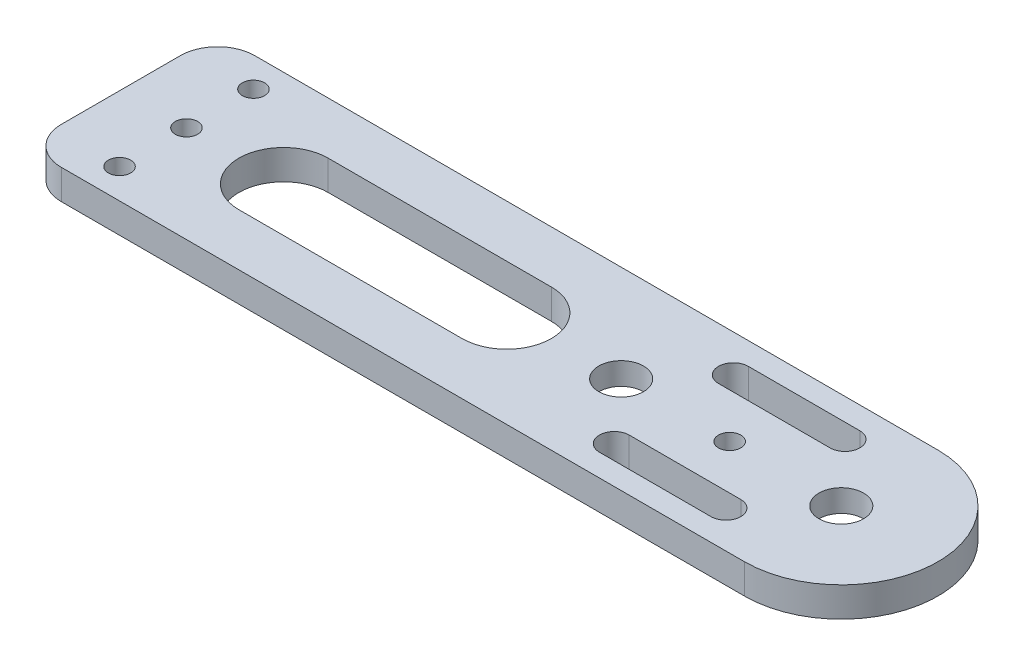
ISO-10303-21;
HEADER;
FILE_DESCRIPTION(('STEP AP214'),'2;1');
FILE_NAME('part.step','',(''),(''),'','','');
FILE_SCHEMA(('AUTOMOTIVE_DESIGN { 1 0 10303 214 1 1 1 1 }'));
ENDSEC;
DATA;
#1=APPLICATION_CONTEXT('core data for automotive mechanical design processes');
#2=APPLICATION_PROTOCOL_DEFINITION('international standard','automotive_design',2000,#1);
#3=PRODUCT_CONTEXT('',#1,'mechanical');
#4=PRODUCT('Part','Part','',(#3));
#5=PRODUCT_RELATED_PRODUCT_CATEGORY('part','',(#4));
#6=PRODUCT_DEFINITION_FORMATION('','',#4);
#7=PRODUCT_DEFINITION_CONTEXT('part definition',#1,'design');
#8=PRODUCT_DEFINITION('design','',#6,#7);
#9=PRODUCT_DEFINITION_SHAPE('','',#8);
#10=(LENGTH_UNIT() NAMED_UNIT(*) SI_UNIT(.MILLI.,.METRE.));
#11=(NAMED_UNIT(*) PLANE_ANGLE_UNIT() SI_UNIT($,.RADIAN.));
#12=(NAMED_UNIT(*) SI_UNIT($,.STERADIAN.) SOLID_ANGLE_UNIT());
#13=UNCERTAINTY_MEASURE_WITH_UNIT(LENGTH_MEASURE(1.E-05),#10,'distance_accuracy_value','');
#14=(GEOMETRIC_REPRESENTATION_CONTEXT(3) GLOBAL_UNCERTAINTY_ASSIGNED_CONTEXT((#13)) GLOBAL_UNIT_ASSIGNED_CONTEXT((#10,
#11,#12)) REPRESENTATION_CONTEXT('',''));
#15=CARTESIAN_POINT('',(0.,0.,0.));
#16=DIRECTION('',(0.,0.,1.));
#17=DIRECTION('',(1.,0.,0.));
#18=AXIS2_PLACEMENT_3D('',#15,#16,#17);
#19=CARTESIAN_POINT('',(150.,4.,0.));
#20=DIRECTION('',(0.,1.,0.));
#21=DIRECTION('',(0.,0.,1.));
#22=AXIS2_PLACEMENT_3D('',#19,#20,#21);
#23=PLANE('',#22);
#24=DIRECTION('',(-1.,0.,0.));
#25=VECTOR('',#24,1.);
#26=CARTESIAN_POINT('',(142.5,4.,6.));
#27=LINE('',#26,#25);
#28=CARTESIAN_POINT('',(142.5,4.,6.));
#29=VERTEX_POINT('',#28);
#30=CARTESIAN_POINT('',(127.5,4.,6.));
#31=VERTEX_POINT('',#30);
#32=EDGE_CURVE('E173',#29,#31,#27,.T.);
#33=ORIENTED_EDGE('',*,*,#32,.F.);
#34=CARTESIAN_POINT('',(142.5,4.,8.));
#35=DIRECTION('',(0.,1.,0.));
#36=DIRECTION('',(0.,0.,-1.));
#37=AXIS2_PLACEMENT_3D('',#34,#35,#36);
#38=CIRCLE('',#37,2.);
#39=CARTESIAN_POINT('',(142.5,4.,10.));
#40=VERTEX_POINT('',#39);
#41=EDGE_CURVE('E163',#40,#29,#38,.T.);
#42=ORIENTED_EDGE('',*,*,#41,.F.);
#43=DIRECTION('',(1.,0.,0.));
#44=VECTOR('',#43,1.);
#45=CARTESIAN_POINT('',(142.5,4.,10.));
#46=LINE('',#45,#44);
#47=CARTESIAN_POINT('',(127.5,4.,10.));
#48=VERTEX_POINT('',#47);
#49=EDGE_CURVE('E189',#48,#40,#46,.T.);
#50=ORIENTED_EDGE('',*,*,#49,.F.);
#51=CARTESIAN_POINT('',(127.5,4.,8.));
#52=DIRECTION('',(0.,1.,0.));
#53=DIRECTION('',(0.,0.,-1.));
#54=AXIS2_PLACEMENT_3D('',#51,#52,#53);
#55=CIRCLE('',#54,2.);
#56=EDGE_CURVE('E187',#31,#48,#55,.T.);
#57=ORIENTED_EDGE('',*,*,#56,.F.);
#58=EDGE_LOOP('',(#33,#42,#50,#57));
#59=FACE_BOUND('',#58,.T.);
#60=DIRECTION('',(-1.,0.,0.));
#61=VECTOR('',#60,1.);
#62=CARTESIAN_POINT('',(142.5,4.,-10.));
#63=LINE('',#62,#61);
#64=CARTESIAN_POINT('',(142.5,4.,-10.));
#65=VERTEX_POINT('',#64);
#66=CARTESIAN_POINT('',(127.5,4.,-10.));
#67=VERTEX_POINT('',#66);
#68=EDGE_CURVE('E209',#65,#67,#63,.T.);
#69=ORIENTED_EDGE('',*,*,#68,.F.);
#70=CARTESIAN_POINT('',(142.5,4.,-8.));
#71=DIRECTION('',(0.,1.,0.));
#72=DIRECTION('',(0.,0.,1.));
#73=AXIS2_PLACEMENT_3D('',#70,#71,#72);
#74=CIRCLE('',#73,2.);
#75=CARTESIAN_POINT('',(142.5,4.,-6.));
#76=VERTEX_POINT('',#75);
#77=EDGE_CURVE('E207',#76,#65,#74,.T.);
#78=ORIENTED_EDGE('',*,*,#77,.F.);
#79=DIRECTION('',(1.,0.,0.));
#80=VECTOR('',#79,1.);
#81=CARTESIAN_POINT('',(142.5,4.,-6.));
#82=LINE('',#81,#80);
#83=CARTESIAN_POINT('',(127.5,4.,-6.));
#84=VERTEX_POINT('',#83);
#85=EDGE_CURVE('E215',#84,#76,#82,.T.);
#86=ORIENTED_EDGE('',*,*,#85,.F.);
#87=CARTESIAN_POINT('',(127.5,4.,-8.));
#88=DIRECTION('',(0.,1.,0.));
#89=DIRECTION('',(0.,0.,1.));
#90=AXIS2_PLACEMENT_3D('',#87,#88,#89);
#91=CIRCLE('',#90,2.);
#92=EDGE_CURVE('E212',#67,#84,#91,.T.);
#93=ORIENTED_EDGE('',*,*,#92,.F.);
#94=EDGE_LOOP('',(#69,#78,#86,#93));
#95=FACE_BOUND('',#94,.T.);
#96=CARTESIAN_POINT('',(62.,4.,9.));
#97=DIRECTION('',(0.,1.,0.));
#98=DIRECTION('',(0.,0.,1.));
#99=AXIS2_PLACEMENT_3D('',#96,#97,#98);
#100=CIRCLE('',#99,1.5);
#101=CARTESIAN_POINT('',(62.,4.,10.5));
#102=VERTEX_POINT('',#101);
#103=EDGE_CURVE('E238',#102,#102,#100,.T.);
#104=ORIENTED_EDGE('',*,*,#103,.F.);
#105=EDGE_LOOP('',(#104));
#106=FACE_BOUND('',#105,.T.);
#107=CARTESIAN_POINT('',(62.,4.,0.));
#108=DIRECTION('',(0.,1.,0.));
#109=DIRECTION('',(0.,0.,1.));
#110=AXIS2_PLACEMENT_3D('',#107,#108,#109);
#111=CIRCLE('',#110,1.5);
#112=CARTESIAN_POINT('',(62.,4.,1.5));
#113=VERTEX_POINT('',#112);
#114=EDGE_CURVE('E250',#113,#113,#111,.T.);
#115=ORIENTED_EDGE('',*,*,#114,.F.);
#116=EDGE_LOOP('',(#115));
#117=FACE_BOUND('',#116,.T.);
#118=DIRECTION('',(-1.,0.,0.));
#119=VECTOR('',#118,1.);
#120=CARTESIAN_POINT('',(105.041482469235,4.,-6.00000000000001));
#121=LINE('',#120,#119);
#122=CARTESIAN_POINT('',(105.041482469235,4.,-6.00000000000001));
#123=VERTEX_POINT('',#122);
#124=CARTESIAN_POINT('',(75.0414824692345,4.,-6.));
#125=VERTEX_POINT('',#124);
#126=EDGE_CURVE('E264',#123,#125,#121,.T.);
#127=ORIENTED_EDGE('',*,*,#126,.F.);
#128=CARTESIAN_POINT('',(105.041482469235,4.,0.));
#129=DIRECTION('',(0.,1.,0.));
#130=DIRECTION('',(0.,0.,1.));
#131=AXIS2_PLACEMENT_3D('',#128,#129,#130);
#132=CIRCLE('',#131,6.);
#133=CARTESIAN_POINT('',(105.041482469235,4.,5.99999999999999));
#134=VERTEX_POINT('',#133);
#135=EDGE_CURVE('E262',#134,#123,#132,.T.);
#136=ORIENTED_EDGE('',*,*,#135,.F.);
#137=DIRECTION('',(1.,0.,0.));
#138=VECTOR('',#137,1.);
#139=CARTESIAN_POINT('',(105.041482469235,4.,5.99999999999999));
#140=LINE('',#139,#138);
#141=CARTESIAN_POINT('',(75.0414824692345,4.,6.));
#142=VERTEX_POINT('',#141);
#143=EDGE_CURVE('E270',#142,#134,#140,.T.);
#144=ORIENTED_EDGE('',*,*,#143,.F.);
#145=CARTESIAN_POINT('',(75.0414824692345,4.,0.));
#146=DIRECTION('',(0.,1.,0.));
#147=DIRECTION('',(0.,0.,1.));
#148=AXIS2_PLACEMENT_3D('',#145,#146,#147);
#149=CIRCLE('',#148,6.);
#150=EDGE_CURVE('E267',#125,#142,#149,.T.);
#151=ORIENTED_EDGE('',*,*,#150,.F.);
#152=EDGE_LOOP('',(#127,#136,#144,#151));
#153=FACE_BOUND('',#152,.T.);
#154=CARTESIAN_POINT('',(120.4195,4.,0.));
#155=DIRECTION('',(0.,1.,0.));
#156=DIRECTION('',(0.,0.,1.));
#157=AXIS2_PLACEMENT_3D('',#154,#155,#156);
#158=CIRCLE('',#157,3.00000000000001);
#159=CARTESIAN_POINT('',(120.4195,4.,3.00000000000001));
#160=VERTEX_POINT('',#159);
#161=EDGE_CURVE('E292',#160,#160,#158,.T.);
#162=ORIENTED_EDGE('',*,*,#161,.F.);
#163=EDGE_LOOP('',(#162));
#164=FACE_BOUND('',#163,.T.);
#165=CARTESIAN_POINT('',(150.,4.,0.));
#166=DIRECTION('',(0.,1.,0.));
#167=DIRECTION('',(0.,0.,1.));
#168=AXIS2_PLACEMENT_3D('',#165,#166,#167);
#169=CIRCLE('',#168,2.99999999999999);
#170=CARTESIAN_POINT('',(150.,4.,2.99999999999999));
#171=VERTEX_POINT('',#170);
#172=EDGE_CURVE('E295',#171,#171,#169,.T.);
#173=ORIENTED_EDGE('',*,*,#172,.F.);
#174=EDGE_LOOP('',(#173));
#175=FACE_BOUND('',#174,.T.);
#176=CARTESIAN_POINT('',(135.,4.,0.));
#177=DIRECTION('',(0.,1.,0.));
#178=DIRECTION('',(0.,0.,1.));
#179=AXIS2_PLACEMENT_3D('',#176,#177,#178);
#180=CIRCLE('',#179,1.5);
#181=CARTESIAN_POINT('',(135.,4.,1.5));
#182=VERTEX_POINT('',#181);
#183=EDGE_CURVE('E256',#182,#182,#180,.T.);
#184=ORIENTED_EDGE('',*,*,#183,.F.);
#185=EDGE_LOOP('',(#184));
#186=FACE_BOUND('',#185,.T.);
#187=CARTESIAN_POINT('',(62.,4.,-9.));
#188=DIRECTION('',(0.,1.,0.));
#189=DIRECTION('',(0.,0.,1.));
#190=AXIS2_PLACEMENT_3D('',#187,#188,#189);
#191=CIRCLE('',#190,1.5);
#192=CARTESIAN_POINT('',(62.,4.,-7.5));
#193=VERTEX_POINT('',#192);
#194=EDGE_CURVE('E244',#193,#193,#191,.T.);
#195=ORIENTED_EDGE('',*,*,#194,.F.);
#196=EDGE_LOOP('',(#195));
#197=FACE_BOUND('',#196,.T.);
#198=DIRECTION('',(-1.,0.,0.));
#199=VECTOR('',#198,1.);
#200=CARTESIAN_POINT('',(150.,4.,-13.));
#201=LINE('',#200,#199);
#202=CARTESIAN_POINT('',(150.,4.,-13.));
#203=VERTEX_POINT('',#202);
#204=CARTESIAN_POINT('',(58.1782411874855,4.,-13.));
#205=VERTEX_POINT('',#204);
#206=EDGE_CURVE('E302',#203,#205,#201,.T.);
#207=ORIENTED_EDGE('',*,*,#206,.T.);
#208=CARTESIAN_POINT('',(58.1782411874856,4.,-7.99999999999999));
#209=DIRECTION('',(0.,1.,0.));
#210=DIRECTION('',(0.,0.,1.));
#211=AXIS2_PLACEMENT_3D('',#208,#209,#210);
#212=CIRCLE('',#211,5.);
#213=CARTESIAN_POINT('',(53.1782411874856,4.,-7.99999999999999));
#214=VERTEX_POINT('',#213);
#215=EDGE_CURVE('E45',#205,#214,#212,.T.);
#216=ORIENTED_EDGE('',*,*,#215,.T.);
#217=DIRECTION('',(0.,0.,1.));
#218=VECTOR('',#217,1.);
#219=CARTESIAN_POINT('',(53.1782411874856,4.,-23.043979085771));
#220=LINE('',#219,#218);
#221=CARTESIAN_POINT('',(53.1782411874856,4.,8.00000000000001));
#222=VERTEX_POINT('',#221);
#223=EDGE_CURVE('E337',#214,#222,#220,.T.);
#224=ORIENTED_EDGE('',*,*,#223,.T.);
#225=CARTESIAN_POINT('',(58.1782411874856,4.,8.00000000000001));
#226=DIRECTION('',(0.,1.,0.));
#227=DIRECTION('',(0.,0.,1.));
#228=AXIS2_PLACEMENT_3D('',#225,#226,#227);
#229=CIRCLE('',#228,5.);
#230=CARTESIAN_POINT('',(58.1782411874855,4.,13.));
#231=VERTEX_POINT('',#230);
#232=EDGE_CURVE('E52',#222,#231,#229,.T.);
#233=ORIENTED_EDGE('',*,*,#232,.T.);
#234=DIRECTION('',(1.,0.,0.));
#235=VECTOR('',#234,1.);
#236=CARTESIAN_POINT('',(150.,4.,13.));
#237=LINE('',#236,#235);
#238=CARTESIAN_POINT('',(150.,4.,13.));
#239=VERTEX_POINT('',#238);
#240=EDGE_CURVE('E305',#231,#239,#237,.T.);
#241=ORIENTED_EDGE('',*,*,#240,.T.);
#242=CARTESIAN_POINT('',(150.,4.,0.));
#243=DIRECTION('',(0.,1.,0.));
#244=DIRECTION('',(0.,0.,1.));
#245=AXIS2_PLACEMENT_3D('',#242,#243,#244);
#246=CIRCLE('',#245,13.);
#247=EDGE_CURVE('E299',#239,#203,#246,.T.);
#248=ORIENTED_EDGE('',*,*,#247,.T.);
#249=EDGE_LOOP('',(#207,#216,#224,#233,#241,#248));
#250=FACE_BOUND('',#249,.T.);
#251=ADVANCED_FACE('F37',(#59,#95,#106,#117,#153,#164,#175,#186,#197,#250),#23,.T.);
#252=CARTESIAN_POINT('',(150.,0.,0.));
#253=DIRECTION('',(0.,1.,0.));
#254=DIRECTION('',(0.,0.,1.));
#255=AXIS2_PLACEMENT_3D('',#252,#253,#254);
#256=PLANE('',#255);
#257=CARTESIAN_POINT('',(142.5,0.,8.));
#258=DIRECTION('',(0.,1.,0.));
#259=DIRECTION('',(0.,0.,-1.));
#260=AXIS2_PLACEMENT_3D('',#257,#258,#259);
#261=CIRCLE('',#260,2.);
#262=CARTESIAN_POINT('',(142.5,0.,10.));
#263=VERTEX_POINT('',#262);
#264=CARTESIAN_POINT('',(142.5,0.,6.));
#265=VERTEX_POINT('',#264);
#266=EDGE_CURVE('E194',#263,#265,#261,.T.);
#267=ORIENTED_EDGE('',*,*,#266,.T.);
#268=DIRECTION('',(-1.,0.,0.));
#269=VECTOR('',#268,1.);
#270=CARTESIAN_POINT('',(142.5,0.,6.));
#271=LINE('',#270,#269);
#272=CARTESIAN_POINT('',(127.5,0.,6.));
#273=VERTEX_POINT('',#272);
#274=EDGE_CURVE('E180',#265,#273,#271,.T.);
#275=ORIENTED_EDGE('',*,*,#274,.T.);
#276=CARTESIAN_POINT('',(127.5,0.,8.));
#277=DIRECTION('',(0.,1.,0.));
#278=DIRECTION('',(0.,0.,-1.));
#279=AXIS2_PLACEMENT_3D('',#276,#277,#278);
#280=CIRCLE('',#279,2.);
#281=CARTESIAN_POINT('',(127.5,0.,10.));
#282=VERTEX_POINT('',#281);
#283=EDGE_CURVE('E198',#273,#282,#280,.T.);
#284=ORIENTED_EDGE('',*,*,#283,.T.);
#285=DIRECTION('',(1.,0.,0.));
#286=VECTOR('',#285,1.);
#287=CARTESIAN_POINT('',(142.5,0.,10.));
#288=LINE('',#287,#286);
#289=EDGE_CURVE('E174',#282,#263,#288,.T.);
#290=ORIENTED_EDGE('',*,*,#289,.T.);
#291=EDGE_LOOP('',(#267,#275,#284,#290));
#292=FACE_BOUND('',#291,.T.);
#293=CARTESIAN_POINT('',(62.,0.,9.));
#294=DIRECTION('',(0.,1.,0.));
#295=DIRECTION('',(0.,0.,1.));
#296=AXIS2_PLACEMENT_3D('',#293,#294,#295);
#297=CIRCLE('',#296,1.5);
#298=CARTESIAN_POINT('',(62.,0.,10.5));
#299=VERTEX_POINT('',#298);
#300=EDGE_CURVE('E237',#299,#299,#297,.T.);
#301=ORIENTED_EDGE('',*,*,#300,.T.);
#302=EDGE_LOOP('',(#301));
#303=FACE_BOUND('',#302,.T.);
#304=CARTESIAN_POINT('',(62.,0.,-9.));
#305=DIRECTION('',(0.,1.,0.));
#306=DIRECTION('',(0.,0.,1.));
#307=AXIS2_PLACEMENT_3D('',#304,#305,#306);
#308=CIRCLE('',#307,1.5);
#309=CARTESIAN_POINT('',(62.,0.,-7.5));
#310=VERTEX_POINT('',#309);
#311=EDGE_CURVE('E241',#310,#310,#308,.T.);
#312=ORIENTED_EDGE('',*,*,#311,.T.);
#313=EDGE_LOOP('',(#312));
#314=FACE_BOUND('',#313,.T.);
#315=CARTESIAN_POINT('',(62.,0.,0.));
#316=DIRECTION('',(0.,1.,0.));
#317=DIRECTION('',(0.,0.,1.));
#318=AXIS2_PLACEMENT_3D('',#315,#316,#317);
#319=CIRCLE('',#318,1.5);
#320=CARTESIAN_POINT('',(62.,0.,1.5));
#321=VERTEX_POINT('',#320);
#322=EDGE_CURVE('E247',#321,#321,#319,.T.);
#323=ORIENTED_EDGE('',*,*,#322,.T.);
#324=EDGE_LOOP('',(#323));
#325=FACE_BOUND('',#324,.T.);
#326=CARTESIAN_POINT('',(135.,0.,0.));
#327=DIRECTION('',(0.,1.,0.));
#328=DIRECTION('',(0.,0.,1.));
#329=AXIS2_PLACEMENT_3D('',#326,#327,#328);
#330=CIRCLE('',#329,1.5);
#331=CARTESIAN_POINT('',(135.,0.,1.5));
#332=VERTEX_POINT('',#331);
#333=EDGE_CURVE('E253',#332,#332,#330,.T.);
#334=ORIENTED_EDGE('',*,*,#333,.T.);
#335=EDGE_LOOP('',(#334));
#336=FACE_BOUND('',#335,.T.);
#337=CARTESIAN_POINT('',(105.041482469235,0.,0.));
#338=DIRECTION('',(0.,1.,0.));
#339=DIRECTION('',(0.,0.,1.));
#340=AXIS2_PLACEMENT_3D('',#337,#338,#339);
#341=CIRCLE('',#340,6.);
#342=CARTESIAN_POINT('',(105.041482469235,0.,5.99999999999999));
#343=VERTEX_POINT('',#342);
#344=CARTESIAN_POINT('',(105.041482469235,0.,-6.00000000000001));
#345=VERTEX_POINT('',#344);
#346=EDGE_CURVE('E259',#343,#345,#341,.T.);
#347=ORIENTED_EDGE('',*,*,#346,.T.);
#348=DIRECTION('',(-1.,0.,0.));
#349=VECTOR('',#348,1.);
#350=CARTESIAN_POINT('',(105.041482469235,0.,-6.00000000000001));
#351=LINE('',#350,#349);
#352=CARTESIAN_POINT('',(75.0414824692345,0.,-6.));
#353=VERTEX_POINT('',#352);
#354=EDGE_CURVE('E275',#345,#353,#351,.T.);
#355=ORIENTED_EDGE('',*,*,#354,.T.);
#356=CARTESIAN_POINT('',(75.0414824692345,0.,0.));
#357=DIRECTION('',(0.,1.,0.));
#358=DIRECTION('',(0.,0.,1.));
#359=AXIS2_PLACEMENT_3D('',#356,#357,#358);
#360=CIRCLE('',#359,6.);
#361=CARTESIAN_POINT('',(75.0414824692345,0.,6.));
#362=VERTEX_POINT('',#361);
#363=EDGE_CURVE('E278',#353,#362,#360,.T.);
#364=ORIENTED_EDGE('',*,*,#363,.T.);
#365=DIRECTION('',(1.,0.,0.));
#366=VECTOR('',#365,1.);
#367=CARTESIAN_POINT('',(105.041482469235,0.,5.99999999999999));
#368=LINE('',#367,#366);
#369=EDGE_CURVE('E265',#362,#343,#368,.T.);
#370=ORIENTED_EDGE('',*,*,#369,.T.);
#371=EDGE_LOOP('',(#347,#355,#364,#370));
#372=FACE_BOUND('',#371,.T.);
#373=CARTESIAN_POINT('',(142.5,0.,-8.));
#374=DIRECTION('',(0.,1.,0.));
#375=DIRECTION('',(0.,0.,1.));
#376=AXIS2_PLACEMENT_3D('',#373,#374,#375);
#377=CIRCLE('',#376,2.);
#378=CARTESIAN_POINT('',(142.5,0.,-6.));
#379=VERTEX_POINT('',#378);
#380=CARTESIAN_POINT('',(142.5,0.,-10.));
#381=VERTEX_POINT('',#380);
#382=EDGE_CURVE('E181',#379,#381,#377,.T.);
#383=ORIENTED_EDGE('',*,*,#382,.T.);
#384=DIRECTION('',(-1.,0.,0.));
#385=VECTOR('',#384,1.);
#386=CARTESIAN_POINT('',(142.5,0.,-10.));
#387=LINE('',#386,#385);
#388=CARTESIAN_POINT('',(127.5,0.,-10.));
#389=VERTEX_POINT('',#388);
#390=EDGE_CURVE('E220',#381,#389,#387,.T.);
#391=ORIENTED_EDGE('',*,*,#390,.T.);
#392=CARTESIAN_POINT('',(127.5,0.,-8.));
#393=DIRECTION('',(0.,1.,0.));
#394=DIRECTION('',(0.,0.,1.));
#395=AXIS2_PLACEMENT_3D('',#392,#393,#394);
#396=CIRCLE('',#395,2.);
#397=CARTESIAN_POINT('',(127.5,0.,-6.));
#398=VERTEX_POINT('',#397);
#399=EDGE_CURVE('E223',#389,#398,#396,.T.);
#400=ORIENTED_EDGE('',*,*,#399,.T.);
#401=DIRECTION('',(1.,0.,0.));
#402=VECTOR('',#401,1.);
#403=CARTESIAN_POINT('',(142.5,0.,-6.));
#404=LINE('',#403,#402);
#405=EDGE_CURVE('E210',#398,#379,#404,.T.);
#406=ORIENTED_EDGE('',*,*,#405,.T.);
#407=EDGE_LOOP('',(#383,#391,#400,#406));
#408=FACE_BOUND('',#407,.T.);
#409=CARTESIAN_POINT('',(120.4195,0.,0.));
#410=DIRECTION('',(0.,-1.,0.));
#411=DIRECTION('',(0.,0.,-1.));
#412=AXIS2_PLACEMENT_3D('',#409,#410,#411);
#413=CIRCLE('',#412,6.01000000000001);
#414=CARTESIAN_POINT('',(120.4195,0.,-6.01000000000001));
#415=VERTEX_POINT('',#414);
#416=EDGE_CURVE('E654',#415,#415,#413,.T.);
#417=ORIENTED_EDGE('',*,*,#416,.F.);
#418=EDGE_LOOP('',(#417));
#419=FACE_BOUND('',#418,.T.);
#420=CARTESIAN_POINT('',(150.,0.,0.));
#421=DIRECTION('',(0.,-1.,0.));
#422=DIRECTION('',(0.,0.,-1.));
#423=AXIS2_PLACEMENT_3D('',#420,#421,#422);
#424=CIRCLE('',#423,6.01);
#425=CARTESIAN_POINT('',(150.,0.,-6.01));
#426=VERTEX_POINT('',#425);
#427=EDGE_CURVE('E646',#426,#426,#424,.T.);
#428=ORIENTED_EDGE('',*,*,#427,.F.);
#429=EDGE_LOOP('',(#428));
#430=FACE_BOUND('',#429,.T.);
#431=DIRECTION('',(0.,0.,1.));
#432=VECTOR('',#431,1.);
#433=CARTESIAN_POINT('',(53.1782411874856,0.,0.));
#434=LINE('',#433,#432);
#435=CARTESIAN_POINT('',(53.1782411874856,0.,-7.99999999999999));
#436=VERTEX_POINT('',#435);
#437=CARTESIAN_POINT('',(53.1782411874856,0.,8.00000000000001));
#438=VERTEX_POINT('',#437);
#439=EDGE_CURVE('E345',#436,#438,#434,.T.);
#440=ORIENTED_EDGE('',*,*,#439,.F.);
#441=CARTESIAN_POINT('',(58.1782411874856,0.,-7.99999999999999));
#442=DIRECTION('',(0.,1.,0.));
#443=DIRECTION('',(0.,0.,1.));
#444=AXIS2_PLACEMENT_3D('',#441,#442,#443);
#445=CIRCLE('',#444,5.);
#446=CARTESIAN_POINT('',(58.1782411874855,0.,-13.));
#447=VERTEX_POINT('',#446);
#448=EDGE_CURVE('E332',#436,#447,#445,.F.);
#449=ORIENTED_EDGE('',*,*,#448,.T.);
#450=DIRECTION('',(-1.,0.,0.));
#451=VECTOR('',#450,1.);
#452=CARTESIAN_POINT('',(150.,0.,-13.));
#453=LINE('',#452,#451);
#454=CARTESIAN_POINT('',(150.,0.,-13.));
#455=VERTEX_POINT('',#454);
#456=EDGE_CURVE('E310',#455,#447,#453,.T.);
#457=ORIENTED_EDGE('',*,*,#456,.F.);
#458=CARTESIAN_POINT('',(150.,0.,0.));
#459=DIRECTION('',(0.,1.,0.));
#460=DIRECTION('',(0.,0.,1.));
#461=AXIS2_PLACEMENT_3D('',#458,#459,#460);
#462=CIRCLE('',#461,13.);
#463=CARTESIAN_POINT('',(150.,0.,13.));
#464=VERTEX_POINT('',#463);
#465=EDGE_CURVE('E298',#464,#455,#462,.T.);
#466=ORIENTED_EDGE('',*,*,#465,.F.);
#467=DIRECTION('',(1.,0.,0.));
#468=VECTOR('',#467,1.);
#469=CARTESIAN_POINT('',(150.,0.,13.));
#470=LINE('',#469,#468);
#471=CARTESIAN_POINT('',(58.1782411874855,0.,13.));
#472=VERTEX_POINT('',#471);
#473=EDGE_CURVE('E303',#472,#464,#470,.T.);
#474=ORIENTED_EDGE('',*,*,#473,.F.);
#475=CARTESIAN_POINT('',(58.1782411874856,0.,8.00000000000001));
#476=DIRECTION('',(0.,1.,0.));
#477=DIRECTION('',(0.,0.,1.));
#478=AXIS2_PLACEMENT_3D('',#475,#476,#477);
#479=CIRCLE('',#478,5.);
#480=EDGE_CURVE('E330',#472,#438,#479,.F.);
#481=ORIENTED_EDGE('',*,*,#480,.T.);
#482=EDGE_LOOP('',(#440,#449,#457,#466,#474,#481));
#483=FACE_BOUND('',#482,.T.);
#484=ADVANCED_FACE('F349',(#292,#303,#314,#325,#336,#372,#408,#419,#430,#483),#256,.F.);
#485=CARTESIAN_POINT('',(150.,4.,-13.));
#486=DIRECTION('',(0.,0.,1.));
#487=DIRECTION('',(1.,0.,0.));
#488=AXIS2_PLACEMENT_3D('',#485,#486,#487);
#489=PLANE('',#488);
#490=ORIENTED_EDGE('',*,*,#456,.T.);
#491=DIRECTION('',(0.,-1.,0.));
#492=VECTOR('',#491,1.);
#493=CARTESIAN_POINT('',(58.1782411874856,4.,-13.));
#494=LINE('',#493,#492);
#495=EDGE_CURVE('E60',#447,#205,#494,.F.);
#496=ORIENTED_EDGE('',*,*,#495,.T.);
#497=ORIENTED_EDGE('',*,*,#206,.F.);
#498=DIRECTION('',(0.,-1.,0.));
#499=VECTOR('',#498,1.);
#500=CARTESIAN_POINT('',(150.,4.,-13.));
#501=LINE('',#500,#499);
#502=EDGE_CURVE('E315',#203,#455,#501,.T.);
#503=ORIENTED_EDGE('',*,*,#502,.T.);
#504=EDGE_LOOP('',(#490,#496,#497,#503));
#505=FACE_BOUND('',#504,.T.);
#506=ADVANCED_FACE('F351',(#505),#489,.F.);
#507=CARTESIAN_POINT('',(150.,4.,13.));
#508=DIRECTION('',(0.,0.,-1.));
#509=DIRECTION('',(-1.,0.,0.));
#510=AXIS2_PLACEMENT_3D('',#507,#508,#509);
#511=PLANE('',#510);
#512=ORIENTED_EDGE('',*,*,#240,.F.);
#513=DIRECTION('',(0.,1.,0.));
#514=VECTOR('',#513,1.);
#515=CARTESIAN_POINT('',(58.1782411874856,0.,13.));
#516=LINE('',#515,#514);
#517=EDGE_CURVE('E11',#231,#472,#516,.F.);
#518=ORIENTED_EDGE('',*,*,#517,.T.);
#519=ORIENTED_EDGE('',*,*,#473,.T.);
#520=DIRECTION('',(0.,-1.,0.));
#521=VECTOR('',#520,1.);
#522=CARTESIAN_POINT('',(150.,4.,13.));
#523=LINE('',#522,#521);
#524=EDGE_CURVE('E307',#239,#464,#523,.T.);
#525=ORIENTED_EDGE('',*,*,#524,.F.);
#526=EDGE_LOOP('',(#512,#518,#519,#525));
#527=FACE_BOUND('',#526,.T.);
#528=ADVANCED_FACE('F362',(#527),#511,.F.);
#529=CARTESIAN_POINT('',(150.,4.,0.));
#530=DIRECTION('',(0.,-1.,0.));
#531=DIRECTION('',(0.,0.,-1.));
#532=AXIS2_PLACEMENT_3D('',#529,#530,#531);
#533=CYLINDRICAL_SURFACE('',#532,2.99999999999999);
#534=ORIENTED_EDGE('',*,*,#172,.T.);
#535=EDGE_LOOP('',(#534));
#536=FACE_BOUND('',#535,.T.);
#537=CARTESIAN_POINT('',(150.,1.,0.));
#538=DIRECTION('',(0.,-1.,0.));
#539=DIRECTION('',(0.,0.,-1.));
#540=AXIS2_PLACEMENT_3D('',#537,#538,#539);
#541=CIRCLE('',#540,2.99999999999999);
#542=CARTESIAN_POINT('',(150.,1.,-2.99999999999999));
#543=VERTEX_POINT('',#542);
#544=EDGE_CURVE('E196',#543,#543,#541,.T.);
#545=ORIENTED_EDGE('',*,*,#544,.T.);
#546=EDGE_LOOP('',(#545));
#547=FACE_BOUND('',#546,.T.);
#548=ADVANCED_FACE('F364',(#536,#547),#533,.F.);
#549=CARTESIAN_POINT('',(120.4195,4.,0.));
#550=DIRECTION('',(0.,-1.,0.));
#551=DIRECTION('',(0.,0.,-1.));
#552=AXIS2_PLACEMENT_3D('',#549,#550,#551);
#553=CYLINDRICAL_SURFACE('',#552,3.00000000000001);
#554=ORIENTED_EDGE('',*,*,#161,.T.);
#555=EDGE_LOOP('',(#554));
#556=FACE_BOUND('',#555,.T.);
#557=CARTESIAN_POINT('',(120.4195,1.,0.));
#558=DIRECTION('',(0.,-1.,0.));
#559=DIRECTION('',(0.,0.,-1.));
#560=AXIS2_PLACEMENT_3D('',#557,#558,#559);
#561=CIRCLE('',#560,3.00000000000001);
#562=CARTESIAN_POINT('',(120.4195,1.,-3.00000000000001));
#563=VERTEX_POINT('',#562);
#564=EDGE_CURVE('E319',#563,#563,#561,.T.);
#565=ORIENTED_EDGE('',*,*,#564,.T.);
#566=EDGE_LOOP('',(#565));
#567=FACE_BOUND('',#566,.T.);
#568=ADVANCED_FACE('F370',(#556,#567),#553,.F.);
#569=CARTESIAN_POINT('',(150.,4.,0.));
#570=DIRECTION('',(0.,-1.,0.));
#571=DIRECTION('',(0.,0.,-1.));
#572=AXIS2_PLACEMENT_3D('',#569,#570,#571);
#573=CYLINDRICAL_SURFACE('',#572,13.);
#574=ORIENTED_EDGE('',*,*,#465,.T.);
#575=ORIENTED_EDGE('',*,*,#502,.F.);
#576=ORIENTED_EDGE('',*,*,#247,.F.);
#577=ORIENTED_EDGE('',*,*,#524,.T.);
#578=EDGE_LOOP('',(#574,#575,#576,#577));
#579=FACE_BOUND('',#578,.T.);
#580=ADVANCED_FACE('F355',(#579),#573,.T.);
#581=CARTESIAN_POINT('',(105.041482469235,4.,0.));
#582=DIRECTION('',(0.,-1.,0.));
#583=DIRECTION('',(0.,0.,-1.));
#584=AXIS2_PLACEMENT_3D('',#581,#582,#583);
#585=CYLINDRICAL_SURFACE('',#584,6.);
#586=ORIENTED_EDGE('',*,*,#346,.F.);
#587=DIRECTION('',(0.,-1.,0.));
#588=VECTOR('',#587,1.);
#589=CARTESIAN_POINT('',(105.041482469235,4.,5.99999999999999));
#590=LINE('',#589,#588);
#591=EDGE_CURVE('E272',#134,#343,#590,.T.);
#592=ORIENTED_EDGE('',*,*,#591,.F.);
#593=ORIENTED_EDGE('',*,*,#135,.T.);
#594=DIRECTION('',(0.,-1.,0.));
#595=VECTOR('',#594,1.);
#596=CARTESIAN_POINT('',(105.041482469235,4.,-6.00000000000001));
#597=LINE('',#596,#595);
#598=EDGE_CURVE('E289',#123,#345,#597,.T.);
#599=ORIENTED_EDGE('',*,*,#598,.T.);
#600=EDGE_LOOP('',(#586,#592,#593,#599));
#601=FACE_BOUND('',#600,.T.);
#602=ADVANCED_FACE('F385',(#601),#585,.F.);
#603=CARTESIAN_POINT('',(105.041482469235,4.,-6.00000000000001));
#604=DIRECTION('',(0.,0.,1.));
#605=DIRECTION('',(1.,0.,0.));
#606=AXIS2_PLACEMENT_3D('',#603,#604,#605);
#607=PLANE('',#606);
#608=ORIENTED_EDGE('',*,*,#354,.F.);
#609=ORIENTED_EDGE('',*,*,#598,.F.);
#610=ORIENTED_EDGE('',*,*,#126,.T.);
#611=DIRECTION('',(0.,-1.,0.));
#612=VECTOR('',#611,1.);
#613=CARTESIAN_POINT('',(75.0414824692345,4.,-6.));
#614=LINE('',#613,#612);
#615=EDGE_CURVE('E287',#125,#353,#614,.T.);
#616=ORIENTED_EDGE('',*,*,#615,.T.);
#617=EDGE_LOOP('',(#608,#609,#610,#616));
#618=FACE_BOUND('',#617,.T.);
#619=ADVANCED_FACE('F388',(#618),#607,.T.);
#620=CARTESIAN_POINT('',(75.0414824692345,4.,0.));
#621=DIRECTION('',(0.,-1.,0.));
#622=DIRECTION('',(0.,0.,-1.));
#623=AXIS2_PLACEMENT_3D('',#620,#621,#622);
#624=CYLINDRICAL_SURFACE('',#623,6.);
#625=ORIENTED_EDGE('',*,*,#363,.F.);
#626=ORIENTED_EDGE('',*,*,#615,.F.);
#627=ORIENTED_EDGE('',*,*,#150,.T.);
#628=DIRECTION('',(0.,-1.,0.));
#629=VECTOR('',#628,1.);
#630=CARTESIAN_POINT('',(75.0414824692345,4.,6.));
#631=LINE('',#630,#629);
#632=EDGE_CURVE('E285',#142,#362,#631,.T.);
#633=ORIENTED_EDGE('',*,*,#632,.T.);
#634=EDGE_LOOP('',(#625,#626,#627,#633));
#635=FACE_BOUND('',#634,.T.);
#636=ADVANCED_FACE('F392',(#635),#624,.F.);
#637=CARTESIAN_POINT('',(105.041482469235,4.,5.99999999999999));
#638=DIRECTION('',(0.,0.,-1.));
#639=DIRECTION('',(-1.,0.,0.));
#640=AXIS2_PLACEMENT_3D('',#637,#638,#639);
#641=PLANE('',#640);
#642=ORIENTED_EDGE('',*,*,#369,.F.);
#643=ORIENTED_EDGE('',*,*,#632,.F.);
#644=ORIENTED_EDGE('',*,*,#143,.T.);
#645=ORIENTED_EDGE('',*,*,#591,.T.);
#646=EDGE_LOOP('',(#642,#643,#644,#645));
#647=FACE_BOUND('',#646,.T.);
#648=ADVANCED_FACE('F396',(#647),#641,.T.);
#649=CARTESIAN_POINT('',(135.,4.,0.));
#650=DIRECTION('',(0.,-1.,0.));
#651=DIRECTION('',(0.,0.,-1.));
#652=AXIS2_PLACEMENT_3D('',#649,#650,#651);
#653=CYLINDRICAL_SURFACE('',#652,1.5);
#654=ORIENTED_EDGE('',*,*,#183,.T.);
#655=EDGE_LOOP('',(#654));
#656=FACE_BOUND('',#655,.T.);
#657=ORIENTED_EDGE('',*,*,#333,.F.);
#658=EDGE_LOOP('',(#657));
#659=FACE_BOUND('',#658,.T.);
#660=ADVANCED_FACE('F400',(#656,#659),#653,.F.);
#661=CARTESIAN_POINT('',(62.,4.,0.));
#662=DIRECTION('',(0.,-1.,0.));
#663=DIRECTION('',(0.,0.,-1.));
#664=AXIS2_PLACEMENT_3D('',#661,#662,#663);
#665=CYLINDRICAL_SURFACE('',#664,1.5);
#666=ORIENTED_EDGE('',*,*,#114,.T.);
#667=EDGE_LOOP('',(#666));
#668=FACE_BOUND('',#667,.T.);
#669=ORIENTED_EDGE('',*,*,#322,.F.);
#670=EDGE_LOOP('',(#669));
#671=FACE_BOUND('',#670,.T.);
#672=ADVANCED_FACE('F404',(#668,#671),#665,.F.);
#673=CARTESIAN_POINT('',(62.,4.,-9.));
#674=DIRECTION('',(0.,-1.,0.));
#675=DIRECTION('',(0.,0.,-1.));
#676=AXIS2_PLACEMENT_3D('',#673,#674,#675);
#677=CYLINDRICAL_SURFACE('',#676,1.5);
#678=ORIENTED_EDGE('',*,*,#194,.T.);
#679=EDGE_LOOP('',(#678));
#680=FACE_BOUND('',#679,.T.);
#681=ORIENTED_EDGE('',*,*,#311,.F.);
#682=EDGE_LOOP('',(#681));
#683=FACE_BOUND('',#682,.T.);
#684=ADVANCED_FACE('F408',(#680,#683),#677,.F.);
#685=CARTESIAN_POINT('',(62.,4.,9.));
#686=DIRECTION('',(0.,-1.,0.));
#687=DIRECTION('',(0.,0.,-1.));
#688=AXIS2_PLACEMENT_3D('',#685,#686,#687);
#689=CYLINDRICAL_SURFACE('',#688,1.5);
#690=ORIENTED_EDGE('',*,*,#103,.T.);
#691=EDGE_LOOP('',(#690));
#692=FACE_BOUND('',#691,.T.);
#693=ORIENTED_EDGE('',*,*,#300,.F.);
#694=EDGE_LOOP('',(#693));
#695=FACE_BOUND('',#694,.T.);
#696=ADVANCED_FACE('F412',(#692,#695),#689,.F.);
#697=CARTESIAN_POINT('',(142.5,4.,-8.));
#698=DIRECTION('',(0.,-1.,0.));
#699=DIRECTION('',(0.,0.,-1.));
#700=AXIS2_PLACEMENT_3D('',#697,#698,#699);
#701=CYLINDRICAL_SURFACE('',#700,2.);
#702=ORIENTED_EDGE('',*,*,#382,.F.);
#703=DIRECTION('',(0.,-1.,0.));
#704=VECTOR('',#703,1.);
#705=CARTESIAN_POINT('',(142.5,4.,-6.));
#706=LINE('',#705,#704);
#707=EDGE_CURVE('E217',#76,#379,#706,.T.);
#708=ORIENTED_EDGE('',*,*,#707,.F.);
#709=ORIENTED_EDGE('',*,*,#77,.T.);
#710=DIRECTION('',(0.,-1.,0.));
#711=VECTOR('',#710,1.);
#712=CARTESIAN_POINT('',(142.5,4.,-10.));
#713=LINE('',#712,#711);
#714=EDGE_CURVE('E234',#65,#381,#713,.T.);
#715=ORIENTED_EDGE('',*,*,#714,.T.);
#716=EDGE_LOOP('',(#702,#708,#709,#715));
#717=FACE_BOUND('',#716,.T.);
#718=ADVANCED_FACE('F416',(#717),#701,.F.);
#719=CARTESIAN_POINT('',(142.5,4.,-10.));
#720=DIRECTION('',(0.,0.,1.));
#721=DIRECTION('',(1.,0.,0.));
#722=AXIS2_PLACEMENT_3D('',#719,#720,#721);
#723=PLANE('',#722);
#724=ORIENTED_EDGE('',*,*,#390,.F.);
#725=ORIENTED_EDGE('',*,*,#714,.F.);
#726=ORIENTED_EDGE('',*,*,#68,.T.);
#727=DIRECTION('',(0.,-1.,0.));
#728=VECTOR('',#727,1.);
#729=CARTESIAN_POINT('',(127.5,4.,-10.));
#730=LINE('',#729,#728);
#731=EDGE_CURVE('E232',#67,#389,#730,.T.);
#732=ORIENTED_EDGE('',*,*,#731,.T.);
#733=EDGE_LOOP('',(#724,#725,#726,#732));
#734=FACE_BOUND('',#733,.T.);
#735=ADVANCED_FACE('F420',(#734),#723,.T.);
#736=CARTESIAN_POINT('',(127.5,4.,-8.));
#737=DIRECTION('',(0.,-1.,0.));
#738=DIRECTION('',(0.,0.,-1.));
#739=AXIS2_PLACEMENT_3D('',#736,#737,#738);
#740=CYLINDRICAL_SURFACE('',#739,2.);
#741=ORIENTED_EDGE('',*,*,#399,.F.);
#742=ORIENTED_EDGE('',*,*,#731,.F.);
#743=ORIENTED_EDGE('',*,*,#92,.T.);
#744=DIRECTION('',(0.,-1.,0.));
#745=VECTOR('',#744,1.);
#746=CARTESIAN_POINT('',(127.5,4.,-6.));
#747=LINE('',#746,#745);
#748=EDGE_CURVE('E230',#84,#398,#747,.T.);
#749=ORIENTED_EDGE('',*,*,#748,.T.);
#750=EDGE_LOOP('',(#741,#742,#743,#749));
#751=FACE_BOUND('',#750,.T.);
#752=ADVANCED_FACE('F424',(#751),#740,.F.);
#753=CARTESIAN_POINT('',(142.5,4.,-6.));
#754=DIRECTION('',(0.,0.,-1.));
#755=DIRECTION('',(-1.,0.,0.));
#756=AXIS2_PLACEMENT_3D('',#753,#754,#755);
#757=PLANE('',#756);
#758=ORIENTED_EDGE('',*,*,#405,.F.);
#759=ORIENTED_EDGE('',*,*,#748,.F.);
#760=ORIENTED_EDGE('',*,*,#85,.T.);
#761=ORIENTED_EDGE('',*,*,#707,.T.);
#762=EDGE_LOOP('',(#758,#759,#760,#761));
#763=FACE_BOUND('',#762,.T.);
#764=ADVANCED_FACE('F428',(#763),#757,.T.);
#765=CARTESIAN_POINT('',(142.5,4.,8.));
#766=DIRECTION('',(0.,-1.,0.));
#767=DIRECTION('',(0.,0.,-1.));
#768=AXIS2_PLACEMENT_3D('',#765,#766,#767);
#769=CYLINDRICAL_SURFACE('',#768,2.);
#770=ORIENTED_EDGE('',*,*,#266,.F.);
#771=DIRECTION('',(0.,-1.,0.));
#772=VECTOR('',#771,1.);
#773=CARTESIAN_POINT('',(142.5,4.,10.));
#774=LINE('',#773,#772);
#775=EDGE_CURVE('E169',#40,#263,#774,.T.);
#776=ORIENTED_EDGE('',*,*,#775,.F.);
#777=ORIENTED_EDGE('',*,*,#41,.T.);
#778=DIRECTION('',(0.,-1.,0.));
#779=VECTOR('',#778,1.);
#780=CARTESIAN_POINT('',(142.5,4.,6.));
#781=LINE('',#780,#779);
#782=EDGE_CURVE('E166',#29,#265,#781,.T.);
#783=ORIENTED_EDGE('',*,*,#782,.T.);
#784=EDGE_LOOP('',(#770,#776,#777,#783));
#785=FACE_BOUND('',#784,.T.);
#786=ADVANCED_FACE('F165',(#785),#769,.F.);
#787=CARTESIAN_POINT('',(142.5,4.,6.));
#788=DIRECTION('',(0.,0.,1.));
#789=DIRECTION('',(1.,0.,0.));
#790=AXIS2_PLACEMENT_3D('',#787,#788,#789);
#791=PLANE('',#790);
#792=ORIENTED_EDGE('',*,*,#274,.F.);
#793=ORIENTED_EDGE('',*,*,#782,.F.);
#794=ORIENTED_EDGE('',*,*,#32,.T.);
#795=DIRECTION('',(0.,-1.,0.));
#796=VECTOR('',#795,1.);
#797=CARTESIAN_POINT('',(127.5,4.,6.));
#798=LINE('',#797,#796);
#799=EDGE_CURVE('E182',#31,#273,#798,.T.);
#800=ORIENTED_EDGE('',*,*,#799,.T.);
#801=EDGE_LOOP('',(#792,#793,#794,#800));
#802=FACE_BOUND('',#801,.T.);
#803=ADVANCED_FACE('F177',(#802),#791,.T.);
#804=CARTESIAN_POINT('',(127.5,4.,8.));
#805=DIRECTION('',(0.,-1.,0.));
#806=DIRECTION('',(0.,0.,-1.));
#807=AXIS2_PLACEMENT_3D('',#804,#805,#806);
#808=CYLINDRICAL_SURFACE('',#807,2.);
#809=ORIENTED_EDGE('',*,*,#283,.F.);
#810=ORIENTED_EDGE('',*,*,#799,.F.);
#811=ORIENTED_EDGE('',*,*,#56,.T.);
#812=DIRECTION('',(0.,-1.,0.));
#813=VECTOR('',#812,1.);
#814=CARTESIAN_POINT('',(127.5,4.,10.));
#815=LINE('',#814,#813);
#816=EDGE_CURVE('E204',#48,#282,#815,.T.);
#817=ORIENTED_EDGE('',*,*,#816,.T.);
#818=EDGE_LOOP('',(#809,#810,#811,#817));
#819=FACE_BOUND('',#818,.T.);
#820=ADVANCED_FACE('F437',(#819),#808,.F.);
#821=CARTESIAN_POINT('',(142.5,4.,10.));
#822=DIRECTION('',(0.,0.,-1.));
#823=DIRECTION('',(-1.,0.,0.));
#824=AXIS2_PLACEMENT_3D('',#821,#822,#823);
#825=PLANE('',#824);
#826=ORIENTED_EDGE('',*,*,#289,.F.);
#827=ORIENTED_EDGE('',*,*,#816,.F.);
#828=ORIENTED_EDGE('',*,*,#49,.T.);
#829=ORIENTED_EDGE('',*,*,#775,.T.);
#830=EDGE_LOOP('',(#826,#827,#828,#829));
#831=FACE_BOUND('',#830,.T.);
#832=ADVANCED_FACE('F440',(#831),#825,.T.);
#833=CARTESIAN_POINT('',(120.4195,1.,0.));
#834=DIRECTION('',(0.,-1.,0.));
#835=DIRECTION('',(0.,0.,-1.));
#836=AXIS2_PLACEMENT_3D('',#833,#834,#835);
#837=CYLINDRICAL_SURFACE('',#836,6.01000000000001);
#838=CARTESIAN_POINT('',(120.4195,1.,0.));
#839=DIRECTION('',(0.,-1.,0.));
#840=DIRECTION('',(0.,0.,-1.));
#841=AXIS2_PLACEMENT_3D('',#838,#839,#840);
#842=CIRCLE('',#841,6.01000000000001);
#843=CARTESIAN_POINT('',(120.4195,1.,-6.01000000000001));
#844=VERTEX_POINT('',#843);
#845=EDGE_CURVE('E649',#844,#844,#842,.T.);
#846=ORIENTED_EDGE('',*,*,#845,.F.);
#847=EDGE_LOOP('',(#846));
#848=FACE_BOUND('',#847,.T.);
#849=ORIENTED_EDGE('',*,*,#416,.T.);
#850=EDGE_LOOP('',(#849));
#851=FACE_BOUND('',#850,.T.);
#852=ADVANCED_FACE('F444',(#848,#851),#837,.F.);
#853=CARTESIAN_POINT('',(120.4195,1.,0.));
#854=DIRECTION('',(0.,-1.,0.));
#855=DIRECTION('',(0.,0.,-1.));
#856=AXIS2_PLACEMENT_3D('',#853,#854,#855);
#857=PLANE('',#856);
#858=ORIENTED_EDGE('',*,*,#564,.F.);
#859=EDGE_LOOP('',(#858));
#860=FACE_BOUND('',#859,.T.);
#861=ORIENTED_EDGE('',*,*,#845,.T.);
#862=EDGE_LOOP('',(#861));
#863=FACE_BOUND('',#862,.T.);
#864=ADVANCED_FACE('F448',(#860,#863),#857,.T.);
#865=CARTESIAN_POINT('',(150.,1.,0.));
#866=DIRECTION('',(0.,-1.,0.));
#867=DIRECTION('',(0.,0.,-1.));
#868=AXIS2_PLACEMENT_3D('',#865,#866,#867);
#869=CYLINDRICAL_SURFACE('',#868,6.01);
#870=CARTESIAN_POINT('',(150.,1.,0.));
#871=DIRECTION('',(0.,-1.,0.));
#872=DIRECTION('',(0.,0.,-1.));
#873=AXIS2_PLACEMENT_3D('',#870,#871,#872);
#874=CIRCLE('',#873,6.01);
#875=CARTESIAN_POINT('',(150.,1.,-6.01));
#876=VERTEX_POINT('',#875);
#877=EDGE_CURVE('E322',#876,#876,#874,.T.);
#878=ORIENTED_EDGE('',*,*,#877,.F.);
#879=EDGE_LOOP('',(#878));
#880=FACE_BOUND('',#879,.T.);
#881=ORIENTED_EDGE('',*,*,#427,.T.);
#882=EDGE_LOOP('',(#881));
#883=FACE_BOUND('',#882,.T.);
#884=ADVANCED_FACE('F452',(#880,#883),#869,.F.);
#885=CARTESIAN_POINT('',(150.,1.,0.));
#886=DIRECTION('',(0.,-1.,0.));
#887=DIRECTION('',(0.,0.,-1.));
#888=AXIS2_PLACEMENT_3D('',#885,#886,#887);
#889=PLANE('',#888);
#890=ORIENTED_EDGE('',*,*,#544,.F.);
#891=EDGE_LOOP('',(#890));
#892=FACE_BOUND('',#891,.T.);
#893=ORIENTED_EDGE('',*,*,#877,.T.);
#894=EDGE_LOOP('',(#893));
#895=FACE_BOUND('',#894,.T.);
#896=ADVANCED_FACE('F456',(#892,#895),#889,.T.);
#897=CARTESIAN_POINT('',(53.1782411874856,-12.,-23.043979085771));
#898=DIRECTION('',(-1.,0.,0.));
#899=DIRECTION('',(0.,0.,1.));
#900=AXIS2_PLACEMENT_3D('',#897,#898,#899);
#901=PLANE('',#900);
#902=ORIENTED_EDGE('',*,*,#223,.F.);
#903=DIRECTION('',(0.,-1.,0.));
#904=VECTOR('',#903,1.);
#905=CARTESIAN_POINT('',(53.1782411874856,0.,-7.99999999999999));
#906=LINE('',#905,#904);
#907=EDGE_CURVE('E327',#214,#436,#906,.T.);
#908=ORIENTED_EDGE('',*,*,#907,.T.);
#909=ORIENTED_EDGE('',*,*,#439,.T.);
#910=DIRECTION('',(0.,1.,0.));
#911=VECTOR('',#910,1.);
#912=CARTESIAN_POINT('',(53.1782411874856,4.,8.00000000000001));
#913=LINE('',#912,#911);
#914=EDGE_CURVE('E318',#438,#222,#913,.T.);
#915=ORIENTED_EDGE('',*,*,#914,.T.);
#916=EDGE_LOOP('',(#902,#908,#909,#915));
#917=FACE_BOUND('',#916,.T.);
#918=ADVANCED_FACE('F341',(#917),#901,.T.);
#919=CARTESIAN_POINT('',(58.1782411874856,-12.,-7.99999999999999));
#920=DIRECTION('',(0.,1.,0.));
#921=DIRECTION('',(0.,0.,1.));
#922=AXIS2_PLACEMENT_3D('',#919,#920,#921);
#923=CYLINDRICAL_SURFACE('',#922,5.);
#924=ORIENTED_EDGE('',*,*,#215,.F.);
#925=ORIENTED_EDGE('',*,*,#495,.F.);
#926=ORIENTED_EDGE('',*,*,#448,.F.);
#927=ORIENTED_EDGE('',*,*,#907,.F.);
#928=EDGE_LOOP('',(#924,#925,#926,#927));
#929=FACE_BOUND('',#928,.T.);
#930=ADVANCED_FACE('F347',(#929),#923,.T.);
#931=CARTESIAN_POINT('',(58.1782411874856,-12.,8.00000000000001));
#932=DIRECTION('',(0.,-1.,0.));
#933=DIRECTION('',(0.,0.,-1.));
#934=AXIS2_PLACEMENT_3D('',#931,#932,#933);
#935=CYLINDRICAL_SURFACE('',#934,5.);
#936=ORIENTED_EDGE('',*,*,#480,.F.);
#937=ORIENTED_EDGE('',*,*,#517,.F.);
#938=ORIENTED_EDGE('',*,*,#232,.F.);
#939=ORIENTED_EDGE('',*,*,#914,.F.);
#940=EDGE_LOOP('',(#936,#937,#938,#939));
#941=FACE_BOUND('',#940,.T.);
#942=ADVANCED_FACE('F39',(#941),#935,.T.);
#943=CLOSED_SHELL('',(#251,#484,#506,#528,#548,#568,#580,#602,#619,#636,#648,#660,#672,#684,
#696,#718,#735,#752,#764,#786,#803,#820,#832,#852,#864,#884,#896,#918,#930,#942));
#944=MANIFOLD_SOLID_BREP('B2',#943);
#945=ADVANCED_BREP_SHAPE_REPRESENTATION('',(#18,#944),#14);
#946=SHAPE_DEFINITION_REPRESENTATION(#9,#945);
ENDSEC;
END-ISO-10303-21;
